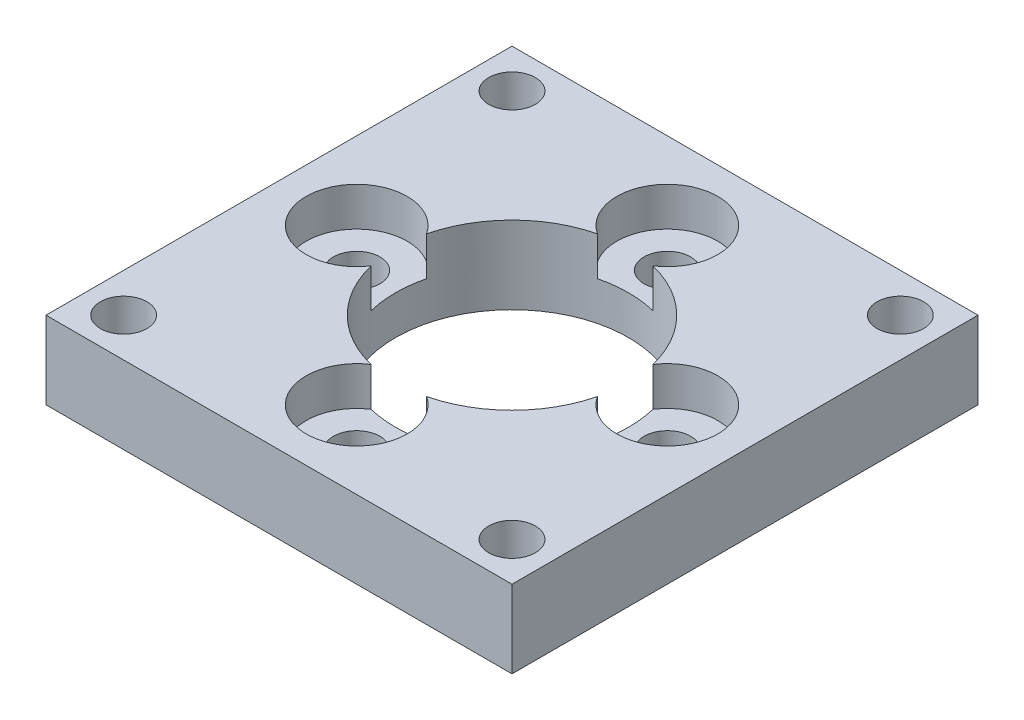
ISO-10303-21;
HEADER;
FILE_DESCRIPTION(('STEP AP214'),'2;1');
FILE_NAME('part.step','',(''),(''),'','','');
FILE_SCHEMA(('AUTOMOTIVE_DESIGN { 1 0 10303 214 1 1 1 1 }'));
ENDSEC;
DATA;
#1=APPLICATION_CONTEXT('core data for automotive mechanical design processes');
#2=APPLICATION_PROTOCOL_DEFINITION('international standard','automotive_design',2000,#1);
#3=PRODUCT_CONTEXT('',#1,'mechanical');
#4=PRODUCT('Part','Part','',(#3));
#5=PRODUCT_RELATED_PRODUCT_CATEGORY('part','',(#4));
#6=PRODUCT_DEFINITION_FORMATION('','',#4);
#7=PRODUCT_DEFINITION_CONTEXT('part definition',#1,'design');
#8=PRODUCT_DEFINITION('design','',#6,#7);
#9=PRODUCT_DEFINITION_SHAPE('','',#8);
#10=(LENGTH_UNIT() NAMED_UNIT(*) SI_UNIT(.MILLI.,.METRE.));
#11=(NAMED_UNIT(*) PLANE_ANGLE_UNIT() SI_UNIT($,.RADIAN.));
#12=(NAMED_UNIT(*) SI_UNIT($,.STERADIAN.) SOLID_ANGLE_UNIT());
#13=UNCERTAINTY_MEASURE_WITH_UNIT(LENGTH_MEASURE(1.E-05),#10,'distance_accuracy_value','');
#14=(GEOMETRIC_REPRESENTATION_CONTEXT(3) GLOBAL_UNCERTAINTY_ASSIGNED_CONTEXT((#13)) GLOBAL_UNIT_ASSIGNED_CONTEXT((#10,
#11,#12)) REPRESENTATION_CONTEXT('',''));
#15=CARTESIAN_POINT('',(0.,0.,0.));
#16=DIRECTION('',(0.,0.,1.));
#17=DIRECTION('',(1.,0.,0.));
#18=AXIS2_PLACEMENT_3D('',#15,#16,#17);
#19=CARTESIAN_POINT('',(50.,0.,-30.));
#20=DIRECTION('',(0.,1.,0.));
#21=DIRECTION('',(0.,0.,1.));
#22=AXIS2_PLACEMENT_3D('',#19,#20,#21);
#23=CYLINDRICAL_SURFACE('',#22,3.00000000000002);
#24=CARTESIAN_POINT('',(50.,0.,-30.));
#25=DIRECTION('',(0.,1.,0.));
#26=DIRECTION('',(0.,0.,1.));
#27=AXIS2_PLACEMENT_3D('',#24,#25,#26);
#28=CIRCLE('',#27,3.00000000000002);
#29=CARTESIAN_POINT('',(50.,0.,-27.));
#30=VERTEX_POINT('',#29);
#31=EDGE_CURVE('E163',#30,#30,#28,.T.);
#32=ORIENTED_EDGE('',*,*,#31,.F.);
#33=EDGE_LOOP('',(#32));
#34=FACE_BOUND('',#33,.T.);
#35=CARTESIAN_POINT('',(50.,5.,-30.));
#36=DIRECTION('',(0.,1.,0.));
#37=DIRECTION('',(0.,0.,1.));
#38=AXIS2_PLACEMENT_3D('',#35,#36,#37);
#39=CIRCLE('',#38,3.00000000000002);
#40=CARTESIAN_POINT('',(50.,5.,-27.));
#41=VERTEX_POINT('',#40);
#42=EDGE_CURVE('E210',#41,#41,#39,.F.);
#43=ORIENTED_EDGE('',*,*,#42,.F.);
#44=EDGE_LOOP('',(#43));
#45=FACE_BOUND('',#44,.T.);
#46=ADVANCED_FACE('F37',(#34,#45),#23,.F.);
#47=CARTESIAN_POINT('',(30.,0.,-10.));
#48=DIRECTION('',(0.,1.,0.));
#49=DIRECTION('',(0.,0.,1.));
#50=AXIS2_PLACEMENT_3D('',#47,#48,#49);
#51=CYLINDRICAL_SURFACE('',#50,3.);
#52=CARTESIAN_POINT('',(30.,0.,-10.));
#53=DIRECTION('',(0.,1.,0.));
#54=DIRECTION('',(0.,0.,1.));
#55=AXIS2_PLACEMENT_3D('',#52,#53,#54);
#56=CIRCLE('',#55,3.);
#57=CARTESIAN_POINT('',(30.,0.,-7.00000000000002));
#58=VERTEX_POINT('',#57);
#59=EDGE_CURVE('E238',#58,#58,#56,.T.);
#60=ORIENTED_EDGE('',*,*,#59,.F.);
#61=EDGE_LOOP('',(#60));
#62=FACE_BOUND('',#61,.T.);
#63=CARTESIAN_POINT('',(30.,5.,-10.));
#64=DIRECTION('',(0.,1.,0.));
#65=DIRECTION('',(0.,0.,1.));
#66=AXIS2_PLACEMENT_3D('',#63,#64,#65);
#67=CIRCLE('',#66,3.);
#68=CARTESIAN_POINT('',(30.,5.,-7.00000000000002));
#69=VERTEX_POINT('',#68);
#70=EDGE_CURVE('E206',#69,#69,#67,.F.);
#71=ORIENTED_EDGE('',*,*,#70,.F.);
#72=EDGE_LOOP('',(#71));
#73=FACE_BOUND('',#72,.T.);
#74=ADVANCED_FACE('F250',(#62,#73),#51,.F.);
#75=CARTESIAN_POINT('',(10.,0.,-30.));
#76=DIRECTION('',(0.,1.,0.));
#77=DIRECTION('',(0.,0.,1.));
#78=AXIS2_PLACEMENT_3D('',#75,#76,#77);
#79=CYLINDRICAL_SURFACE('',#78,3.);
#80=CARTESIAN_POINT('',(10.,0.,-30.));
#81=DIRECTION('',(0.,1.,0.));
#82=DIRECTION('',(0.,0.,1.));
#83=AXIS2_PLACEMENT_3D('',#80,#81,#82);
#84=CIRCLE('',#83,3.);
#85=CARTESIAN_POINT('',(10.,0.,-27.));
#86=VERTEX_POINT('',#85);
#87=EDGE_CURVE('E236',#86,#86,#84,.T.);
#88=ORIENTED_EDGE('',*,*,#87,.F.);
#89=EDGE_LOOP('',(#88));
#90=FACE_BOUND('',#89,.T.);
#91=CARTESIAN_POINT('',(10.,5.,-30.));
#92=DIRECTION('',(0.,1.,0.));
#93=DIRECTION('',(0.,0.,1.));
#94=AXIS2_PLACEMENT_3D('',#91,#92,#93);
#95=CIRCLE('',#94,3.);
#96=CARTESIAN_POINT('',(10.,5.,-27.));
#97=VERTEX_POINT('',#96);
#98=EDGE_CURVE('E202',#97,#97,#95,.F.);
#99=ORIENTED_EDGE('',*,*,#98,.F.);
#100=EDGE_LOOP('',(#99));
#101=FACE_BOUND('',#100,.T.);
#102=ADVANCED_FACE('F282',(#90,#101),#79,.F.);
#103=CARTESIAN_POINT('',(30.,0.,-50.));
#104=DIRECTION('',(0.,1.,0.));
#105=DIRECTION('',(0.,0.,1.));
#106=AXIS2_PLACEMENT_3D('',#103,#104,#105);
#107=CYLINDRICAL_SURFACE('',#106,3.);
#108=CARTESIAN_POINT('',(30.,0.,-50.));
#109=DIRECTION('',(0.,1.,0.));
#110=DIRECTION('',(0.,0.,1.));
#111=AXIS2_PLACEMENT_3D('',#108,#109,#110);
#112=CIRCLE('',#111,3.);
#113=CARTESIAN_POINT('',(30.,0.,-47.));
#114=VERTEX_POINT('',#113);
#115=EDGE_CURVE('E168',#114,#114,#112,.T.);
#116=ORIENTED_EDGE('',*,*,#115,.F.);
#117=EDGE_LOOP('',(#116));
#118=FACE_BOUND('',#117,.T.);
#119=CARTESIAN_POINT('',(30.,5.,-50.));
#120=DIRECTION('',(0.,1.,0.));
#121=DIRECTION('',(0.,0.,1.));
#122=AXIS2_PLACEMENT_3D('',#119,#120,#121);
#123=CIRCLE('',#122,3.);
#124=CARTESIAN_POINT('',(30.,5.,-47.));
#125=VERTEX_POINT('',#124);
#126=EDGE_CURVE('E198',#125,#125,#123,.F.);
#127=ORIENTED_EDGE('',*,*,#126,.F.);
#128=EDGE_LOOP('',(#127));
#129=FACE_BOUND('',#128,.T.);
#130=ADVANCED_FACE('F279',(#118,#129),#107,.F.);
#131=CARTESIAN_POINT('',(0.,10.,0.));
#132=DIRECTION('',(0.,-1.,0.));
#133=DIRECTION('',(0.,0.,-1.));
#134=AXIS2_PLACEMENT_3D('',#131,#132,#133);
#135=PLANE('',#134);
#136=CARTESIAN_POINT('',(4.99999999999999,10.,-55.));
#137=DIRECTION('',(0.,-1.,0.));
#138=DIRECTION('',(0.,0.,-1.));
#139=AXIS2_PLACEMENT_3D('',#136,#137,#138);
#140=CIRCLE('',#139,3.);
#141=CARTESIAN_POINT('',(4.99999999999999,10.,-58.));
#142=VERTEX_POINT('',#141);
#143=EDGE_CURVE('E464',#142,#142,#140,.T.);
#144=ORIENTED_EDGE('',*,*,#143,.T.);
#145=EDGE_LOOP('',(#144));
#146=FACE_BOUND('',#145,.T.);
#147=CARTESIAN_POINT('',(55.,10.,-55.));
#148=DIRECTION('',(0.,-1.,0.));
#149=DIRECTION('',(0.,0.,-1.));
#150=AXIS2_PLACEMENT_3D('',#147,#148,#149);
#151=CIRCLE('',#150,3.00000000000001);
#152=CARTESIAN_POINT('',(55.,10.,-58.));
#153=VERTEX_POINT('',#152);
#154=EDGE_CURVE('E468',#153,#153,#151,.T.);
#155=ORIENTED_EDGE('',*,*,#154,.T.);
#156=EDGE_LOOP('',(#155));
#157=FACE_BOUND('',#156,.T.);
#158=CARTESIAN_POINT('',(55.,10.,-5.));
#159=DIRECTION('',(0.,-1.,0.));
#160=DIRECTION('',(0.,0.,-1.));
#161=AXIS2_PLACEMENT_3D('',#158,#159,#160);
#162=CIRCLE('',#161,3.00000000000001);
#163=CARTESIAN_POINT('',(55.,10.,-8.00000000000001));
#164=VERTEX_POINT('',#163);
#165=EDGE_CURVE('E505',#164,#164,#162,.T.);
#166=ORIENTED_EDGE('',*,*,#165,.T.);
#167=EDGE_LOOP('',(#166));
#168=FACE_BOUND('',#167,.T.);
#169=CARTESIAN_POINT('',(4.99999999999999,10.,-5.));
#170=DIRECTION('',(0.,-1.,0.));
#171=DIRECTION('',(0.,0.,-1.));
#172=AXIS2_PLACEMENT_3D('',#169,#170,#171);
#173=CIRCLE('',#172,3.);
#174=CARTESIAN_POINT('',(4.99999999999999,10.,-8.));
#175=VERTEX_POINT('',#174);
#176=EDGE_CURVE('E476',#175,#175,#173,.T.);
#177=ORIENTED_EDGE('',*,*,#176,.T.);
#178=EDGE_LOOP('',(#177));
#179=FACE_BOUND('',#178,.T.);
#180=DIRECTION('',(0.,0.,1.));
#181=VECTOR('',#180,1.);
#182=CARTESIAN_POINT('',(0.,10.,0.));
#183=LINE('',#182,#181);
#184=CARTESIAN_POINT('',(0.,10.,-60.));
#185=VERTEX_POINT('',#184);
#186=CARTESIAN_POINT('',(0.,10.,0.));
#187=VERTEX_POINT('',#186);
#188=EDGE_CURVE('E169',#185,#187,#183,.T.);
#189=ORIENTED_EDGE('',*,*,#188,.T.);
#190=DIRECTION('',(1.,0.,0.));
#191=VECTOR('',#190,1.);
#192=CARTESIAN_POINT('',(0.,10.,0.));
#193=LINE('',#192,#191);
#194=CARTESIAN_POINT('',(60.,10.,0.));
#195=VERTEX_POINT('',#194);
#196=EDGE_CURVE('E172',#187,#195,#193,.T.);
#197=ORIENTED_EDGE('',*,*,#196,.T.);
#198=DIRECTION('',(0.,0.,-1.));
#199=VECTOR('',#198,1.);
#200=CARTESIAN_POINT('',(60.,10.,0.));
#201=LINE('',#200,#199);
#202=CARTESIAN_POINT('',(60.,10.,-60.));
#203=VERTEX_POINT('',#202);
#204=EDGE_CURVE('E175',#195,#203,#201,.T.);
#205=ORIENTED_EDGE('',*,*,#204,.T.);
#206=DIRECTION('',(-1.,0.,0.));
#207=VECTOR('',#206,1.);
#208=CARTESIAN_POINT('',(0.,10.,-60.));
#209=LINE('',#208,#207);
#210=EDGE_CURVE('E177',#203,#185,#209,.T.);
#211=ORIENTED_EDGE('',*,*,#210,.T.);
#212=EDGE_LOOP('',(#189,#197,#205,#211));
#213=FACE_BOUND('',#212,.T.);
#214=CARTESIAN_POINT('',(30.,10.,-30.));
#215=DIRECTION('',(0.,1.,0.));
#216=DIRECTION('',(0.,0.,1.));
#217=AXIS2_PLACEMENT_3D('',#214,#215,#216);
#218=CIRCLE('',#217,15.);
#219=CARTESIAN_POINT('',(15.43125,10.,-26.4290724681814));
#220=VERTEX_POINT('',#219);
#221=CARTESIAN_POINT('',(26.4290724681814,10.,-15.43125));
#222=VERTEX_POINT('',#221);
#223=EDGE_CURVE('E160',#220,#222,#218,.T.);
#224=ORIENTED_EDGE('',*,*,#223,.F.);
#225=CARTESIAN_POINT('',(9.99999999999998,10.,-30.));
#226=DIRECTION('',(0.,1.,0.));
#227=DIRECTION('',(0.,0.,1.));
#228=AXIS2_PLACEMENT_3D('',#225,#226,#227);
#229=CIRCLE('',#228,6.5);
#230=CARTESIAN_POINT('',(15.43125,10.,-33.5709275318186));
#231=VERTEX_POINT('',#230);
#232=EDGE_CURVE('E225',#231,#220,#229,.T.);
#233=ORIENTED_EDGE('',*,*,#232,.F.);
#234=CARTESIAN_POINT('',(26.4290724681814,10.,-44.56875));
#235=VERTEX_POINT('',#234);
#236=EDGE_CURVE('E147',#235,#231,#218,.T.);
#237=ORIENTED_EDGE('',*,*,#236,.F.);
#238=CARTESIAN_POINT('',(30.,10.,-50.));
#239=DIRECTION('',(0.,1.,0.));
#240=DIRECTION('',(0.,0.,1.));
#241=AXIS2_PLACEMENT_3D('',#238,#239,#240);
#242=CIRCLE('',#241,6.5);
#243=CARTESIAN_POINT('',(33.5709275318186,10.,-44.56875));
#244=VERTEX_POINT('',#243);
#245=EDGE_CURVE('E129',#244,#235,#242,.T.);
#246=ORIENTED_EDGE('',*,*,#245,.F.);
#247=CARTESIAN_POINT('',(44.56875,10.,-33.5709275318186));
#248=VERTEX_POINT('',#247);
#249=EDGE_CURVE('E144',#248,#244,#218,.T.);
#250=ORIENTED_EDGE('',*,*,#249,.F.);
#251=CARTESIAN_POINT('',(50.,10.,-30.));
#252=DIRECTION('',(0.,1.,0.));
#253=DIRECTION('',(0.,0.,1.));
#254=AXIS2_PLACEMENT_3D('',#251,#252,#253);
#255=CIRCLE('',#254,6.49999999999999);
#256=CARTESIAN_POINT('',(44.56875,10.,-26.4290724681814));
#257=VERTEX_POINT('',#256);
#258=EDGE_CURVE('E488',#257,#248,#255,.T.);
#259=ORIENTED_EDGE('',*,*,#258,.F.);
#260=CARTESIAN_POINT('',(33.5709275318185,10.,-15.43125));
#261=VERTEX_POINT('',#260);
#262=EDGE_CURVE('E156',#261,#257,#218,.T.);
#263=ORIENTED_EDGE('',*,*,#262,.F.);
#264=CARTESIAN_POINT('',(30.,10.,-9.99999999999998));
#265=DIRECTION('',(0.,1.,0.));
#266=DIRECTION('',(0.,0.,1.));
#267=AXIS2_PLACEMENT_3D('',#264,#265,#266);
#268=CIRCLE('',#267,6.50000000000001);
#269=EDGE_CURVE('E485',#222,#261,#268,.T.);
#270=ORIENTED_EDGE('',*,*,#269,.F.);
#271=EDGE_LOOP('',(#224,#233,#237,#246,#250,#259,#263,#270));
#272=FACE_BOUND('',#271,.T.);
#273=ADVANCED_FACE('F142',(#146,#157,#168,#179,#213,#272),#135,.F.);
#274=CARTESIAN_POINT('',(0.,0.,0.));
#275=DIRECTION('',(0.,-1.,0.));
#276=DIRECTION('',(0.,0.,-1.));
#277=AXIS2_PLACEMENT_3D('',#274,#275,#276);
#278=PLANE('',#277);
#279=CARTESIAN_POINT('',(4.99999999999999,0.,-55.));
#280=DIRECTION('',(0.,-1.,0.));
#281=DIRECTION('',(0.,0.,-1.));
#282=AXIS2_PLACEMENT_3D('',#279,#280,#281);
#283=CIRCLE('',#282,3.);
#284=CARTESIAN_POINT('',(4.99999999999999,0.,-58.));
#285=VERTEX_POINT('',#284);
#286=EDGE_CURVE('E467',#285,#285,#283,.T.);
#287=ORIENTED_EDGE('',*,*,#286,.F.);
#288=EDGE_LOOP('',(#287));
#289=FACE_BOUND('',#288,.T.);
#290=CARTESIAN_POINT('',(55.,0.,-55.));
#291=DIRECTION('',(0.,-1.,0.));
#292=DIRECTION('',(0.,0.,-1.));
#293=AXIS2_PLACEMENT_3D('',#290,#291,#292);
#294=CIRCLE('',#293,3.00000000000001);
#295=CARTESIAN_POINT('',(55.,0.,-58.));
#296=VERTEX_POINT('',#295);
#297=EDGE_CURVE('E471',#296,#296,#294,.T.);
#298=ORIENTED_EDGE('',*,*,#297,.F.);
#299=EDGE_LOOP('',(#298));
#300=FACE_BOUND('',#299,.T.);
#301=CARTESIAN_POINT('',(55.,0.,-5.));
#302=DIRECTION('',(0.,-1.,0.));
#303=DIRECTION('',(0.,0.,-1.));
#304=AXIS2_PLACEMENT_3D('',#301,#302,#303);
#305=CIRCLE('',#304,3.00000000000001);
#306=CARTESIAN_POINT('',(55.,0.,-8.00000000000001));
#307=VERTEX_POINT('',#306);
#308=EDGE_CURVE('E482',#307,#307,#305,.T.);
#309=ORIENTED_EDGE('',*,*,#308,.F.);
#310=EDGE_LOOP('',(#309));
#311=FACE_BOUND('',#310,.T.);
#312=CARTESIAN_POINT('',(4.99999999999999,0.,-5.));
#313=DIRECTION('',(0.,-1.,0.));
#314=DIRECTION('',(0.,0.,-1.));
#315=AXIS2_PLACEMENT_3D('',#312,#313,#314);
#316=CIRCLE('',#315,3.);
#317=CARTESIAN_POINT('',(4.99999999999999,0.,-8.));
#318=VERTEX_POINT('',#317);
#319=EDGE_CURVE('E479',#318,#318,#316,.T.);
#320=ORIENTED_EDGE('',*,*,#319,.F.);
#321=EDGE_LOOP('',(#320));
#322=FACE_BOUND('',#321,.T.);
#323=ORIENTED_EDGE('',*,*,#115,.T.);
#324=EDGE_LOOP('',(#323));
#325=FACE_BOUND('',#324,.T.);
#326=ORIENTED_EDGE('',*,*,#87,.T.);
#327=EDGE_LOOP('',(#326));
#328=FACE_BOUND('',#327,.T.);
#329=ORIENTED_EDGE('',*,*,#59,.T.);
#330=EDGE_LOOP('',(#329));
#331=FACE_BOUND('',#330,.T.);
#332=ORIENTED_EDGE('',*,*,#31,.T.);
#333=EDGE_LOOP('',(#332));
#334=FACE_BOUND('',#333,.T.);
#335=DIRECTION('',(0.,0.,1.));
#336=VECTOR('',#335,1.);
#337=CARTESIAN_POINT('',(0.,0.,0.));
#338=LINE('',#337,#336);
#339=CARTESIAN_POINT('',(0.,0.,-60.));
#340=VERTEX_POINT('',#339);
#341=CARTESIAN_POINT('',(0.,0.,0.));
#342=VERTEX_POINT('',#341);
#343=EDGE_CURVE('E159',#340,#342,#338,.T.);
#344=ORIENTED_EDGE('',*,*,#343,.F.);
#345=DIRECTION('',(-1.,0.,0.));
#346=VECTOR('',#345,1.);
#347=CARTESIAN_POINT('',(0.,0.,-60.));
#348=LINE('',#347,#346);
#349=CARTESIAN_POINT('',(60.,0.,-60.));
#350=VERTEX_POINT('',#349);
#351=EDGE_CURVE('E173',#350,#340,#348,.T.);
#352=ORIENTED_EDGE('',*,*,#351,.F.);
#353=DIRECTION('',(0.,0.,-1.));
#354=VECTOR('',#353,1.);
#355=CARTESIAN_POINT('',(60.,0.,0.));
#356=LINE('',#355,#354);
#357=CARTESIAN_POINT('',(60.,0.,0.));
#358=VERTEX_POINT('',#357);
#359=EDGE_CURVE('E184',#358,#350,#356,.T.);
#360=ORIENTED_EDGE('',*,*,#359,.F.);
#361=DIRECTION('',(1.,0.,0.));
#362=VECTOR('',#361,1.);
#363=CARTESIAN_POINT('',(0.,0.,0.));
#364=LINE('',#363,#362);
#365=EDGE_CURVE('E182',#342,#358,#364,.T.);
#366=ORIENTED_EDGE('',*,*,#365,.F.);
#367=EDGE_LOOP('',(#344,#352,#360,#366));
#368=FACE_BOUND('',#367,.T.);
#369=CARTESIAN_POINT('',(30.,0.,-30.));
#370=DIRECTION('',(0.,1.,0.));
#371=DIRECTION('',(0.,0.,1.));
#372=AXIS2_PLACEMENT_3D('',#369,#370,#371);
#373=CIRCLE('',#372,15.);
#374=CARTESIAN_POINT('',(30.,0.,-15.));
#375=VERTEX_POINT('',#374);
#376=EDGE_CURVE('E165',#375,#375,#373,.T.);
#377=ORIENTED_EDGE('',*,*,#376,.T.);
#378=EDGE_LOOP('',(#377));
#379=FACE_BOUND('',#378,.T.);
#380=ADVANCED_FACE('F245',(#289,#300,#311,#322,#325,#328,#331,#334,#368,#379),#278,.T.);
#381=CARTESIAN_POINT('',(0.,10.,0.));
#382=DIRECTION('',(1.,0.,0.));
#383=DIRECTION('',(0.,0.,-1.));
#384=AXIS2_PLACEMENT_3D('',#381,#382,#383);
#385=PLANE('',#384);
#386=ORIENTED_EDGE('',*,*,#343,.T.);
#387=DIRECTION('',(0.,-1.,0.));
#388=VECTOR('',#387,1.);
#389=CARTESIAN_POINT('',(0.,10.,0.));
#390=LINE('',#389,#388);
#391=EDGE_CURVE('E195',#187,#342,#390,.T.);
#392=ORIENTED_EDGE('',*,*,#391,.F.);
#393=ORIENTED_EDGE('',*,*,#188,.F.);
#394=DIRECTION('',(0.,-1.,0.));
#395=VECTOR('',#394,1.);
#396=CARTESIAN_POINT('',(0.,10.,-60.));
#397=LINE('',#396,#395);
#398=EDGE_CURVE('E179',#185,#340,#397,.T.);
#399=ORIENTED_EDGE('',*,*,#398,.T.);
#400=EDGE_LOOP('',(#386,#392,#393,#399));
#401=FACE_BOUND('',#400,.T.);
#402=ADVANCED_FACE('F39',(#401),#385,.F.);
#403=CARTESIAN_POINT('',(0.,10.,0.));
#404=DIRECTION('',(0.,0.,-1.));
#405=DIRECTION('',(-1.,0.,0.));
#406=AXIS2_PLACEMENT_3D('',#403,#404,#405);
#407=PLANE('',#406);
#408=ORIENTED_EDGE('',*,*,#365,.T.);
#409=DIRECTION('',(0.,-1.,0.));
#410=VECTOR('',#409,1.);
#411=CARTESIAN_POINT('',(60.,10.,0.));
#412=LINE('',#411,#410);
#413=EDGE_CURVE('E192',#195,#358,#412,.T.);
#414=ORIENTED_EDGE('',*,*,#413,.F.);
#415=ORIENTED_EDGE('',*,*,#196,.F.);
#416=ORIENTED_EDGE('',*,*,#391,.T.);
#417=EDGE_LOOP('',(#408,#414,#415,#416));
#418=FACE_BOUND('',#417,.T.);
#419=ADVANCED_FACE('F304',(#418),#407,.F.);
#420=CARTESIAN_POINT('',(60.,10.,0.));
#421=DIRECTION('',(-1.,0.,0.));
#422=DIRECTION('',(0.,0.,1.));
#423=AXIS2_PLACEMENT_3D('',#420,#421,#422);
#424=PLANE('',#423);
#425=ORIENTED_EDGE('',*,*,#359,.T.);
#426=DIRECTION('',(0.,-1.,0.));
#427=VECTOR('',#426,1.);
#428=CARTESIAN_POINT('',(60.,10.,-60.));
#429=LINE('',#428,#427);
#430=EDGE_CURVE('E189',#203,#350,#429,.T.);
#431=ORIENTED_EDGE('',*,*,#430,.F.);
#432=ORIENTED_EDGE('',*,*,#204,.F.);
#433=ORIENTED_EDGE('',*,*,#413,.T.);
#434=EDGE_LOOP('',(#425,#431,#432,#433));
#435=FACE_BOUND('',#434,.T.);
#436=ADVANCED_FACE('F301',(#435),#424,.F.);
#437=CARTESIAN_POINT('',(0.,10.,-60.));
#438=DIRECTION('',(0.,0.,1.));
#439=DIRECTION('',(1.,0.,0.));
#440=AXIS2_PLACEMENT_3D('',#437,#438,#439);
#441=PLANE('',#440);
#442=ORIENTED_EDGE('',*,*,#351,.T.);
#443=ORIENTED_EDGE('',*,*,#398,.F.);
#444=ORIENTED_EDGE('',*,*,#210,.F.);
#445=ORIENTED_EDGE('',*,*,#430,.T.);
#446=EDGE_LOOP('',(#442,#443,#444,#445));
#447=FACE_BOUND('',#446,.T.);
#448=ADVANCED_FACE('F292',(#447),#441,.F.);
#449=CARTESIAN_POINT('',(30.,10.,-30.));
#450=DIRECTION('',(0.,-1.,0.));
#451=DIRECTION('',(0.,0.,-1.));
#452=AXIS2_PLACEMENT_3D('',#449,#450,#451);
#453=CYLINDRICAL_SURFACE('',#452,15.);
#454=DIRECTION('',(0.,1.,0.));
#455=VECTOR('',#454,1.);
#456=CARTESIAN_POINT('',(15.43125,7.5,-33.5709275318186));
#457=LINE('',#456,#455);
#458=CARTESIAN_POINT('',(15.43125,5.,-33.5709275318186));
#459=VERTEX_POINT('',#458);
#460=EDGE_CURVE('E11',#459,#231,#457,.T.);
#461=ORIENTED_EDGE('',*,*,#460,.F.);
#462=CARTESIAN_POINT('',(30.,5.,-30.));
#463=DIRECTION('',(0.,1.,0.));
#464=DIRECTION('',(0.,0.,1.));
#465=AXIS2_PLACEMENT_3D('',#462,#463,#464);
#466=CIRCLE('',#465,15.);
#467=CARTESIAN_POINT('',(15.43125,5.,-26.4290724681814));
#468=VERTEX_POINT('',#467);
#469=EDGE_CURVE('E205',#459,#468,#466,.T.);
#470=ORIENTED_EDGE('',*,*,#469,.T.);
#471=DIRECTION('',(0.,1.,0.));
#472=VECTOR('',#471,1.);
#473=CARTESIAN_POINT('',(15.43125,7.5,-26.4290724681814));
#474=LINE('',#473,#472);
#475=EDGE_CURVE('E45',#220,#468,#474,.F.);
#476=ORIENTED_EDGE('',*,*,#475,.F.);
#477=ORIENTED_EDGE('',*,*,#223,.T.);
#478=DIRECTION('',(0.,1.,0.));
#479=VECTOR('',#478,1.);
#480=CARTESIAN_POINT('',(26.4290724681814,7.5,-15.43125));
#481=LINE('',#480,#479);
#482=CARTESIAN_POINT('',(26.4290724681814,5.,-15.43125));
#483=VERTEX_POINT('',#482);
#484=EDGE_CURVE('E220',#483,#222,#481,.T.);
#485=ORIENTED_EDGE('',*,*,#484,.F.);
#486=CARTESIAN_POINT('',(30.,5.,-30.));
#487=DIRECTION('',(0.,1.,0.));
#488=DIRECTION('',(0.,0.,1.));
#489=AXIS2_PLACEMENT_3D('',#486,#487,#488);
#490=CIRCLE('',#489,15.);
#491=CARTESIAN_POINT('',(33.5709275318185,5.,-15.43125));
#492=VERTEX_POINT('',#491);
#493=EDGE_CURVE('E209',#483,#492,#490,.T.);
#494=ORIENTED_EDGE('',*,*,#493,.T.);
#495=DIRECTION('',(0.,1.,0.));
#496=VECTOR('',#495,1.);
#497=CARTESIAN_POINT('',(33.5709275318186,7.5,-15.43125));
#498=LINE('',#497,#496);
#499=EDGE_CURVE('E218',#261,#492,#498,.F.);
#500=ORIENTED_EDGE('',*,*,#499,.F.);
#501=ORIENTED_EDGE('',*,*,#262,.T.);
#502=DIRECTION('',(0.,1.,0.));
#503=VECTOR('',#502,1.);
#504=CARTESIAN_POINT('',(44.56875,7.5,-26.4290724681814));
#505=LINE('',#504,#503);
#506=CARTESIAN_POINT('',(44.56875,5.,-26.4290724681814));
#507=VERTEX_POINT('',#506);
#508=EDGE_CURVE('E216',#507,#257,#505,.T.);
#509=ORIENTED_EDGE('',*,*,#508,.F.);
#510=CARTESIAN_POINT('',(30.,5.,-30.));
#511=DIRECTION('',(0.,1.,0.));
#512=DIRECTION('',(0.,0.,1.));
#513=AXIS2_PLACEMENT_3D('',#510,#511,#512);
#514=CIRCLE('',#513,15.);
#515=CARTESIAN_POINT('',(44.56875,5.,-33.5709275318186));
#516=VERTEX_POINT('',#515);
#517=EDGE_CURVE('E213',#507,#516,#514,.T.);
#518=ORIENTED_EDGE('',*,*,#517,.T.);
#519=DIRECTION('',(0.,1.,0.));
#520=VECTOR('',#519,1.);
#521=CARTESIAN_POINT('',(44.56875,7.5,-33.5709275318186));
#522=LINE('',#521,#520);
#523=EDGE_CURVE('E135',#248,#516,#522,.F.);
#524=ORIENTED_EDGE('',*,*,#523,.F.);
#525=ORIENTED_EDGE('',*,*,#249,.T.);
#526=DIRECTION('',(0.,1.,0.));
#527=VECTOR('',#526,1.);
#528=CARTESIAN_POINT('',(33.5709275318186,7.5,-44.56875));
#529=LINE('',#528,#527);
#530=CARTESIAN_POINT('',(33.5709275318186,5.,-44.56875));
#531=VERTEX_POINT('',#530);
#532=EDGE_CURVE('E125',#531,#244,#529,.T.);
#533=ORIENTED_EDGE('',*,*,#532,.F.);
#534=CARTESIAN_POINT('',(30.,5.,-30.));
#535=DIRECTION('',(0.,1.,0.));
#536=DIRECTION('',(0.,0.,1.));
#537=AXIS2_PLACEMENT_3D('',#534,#535,#536);
#538=CIRCLE('',#537,15.);
#539=CARTESIAN_POINT('',(26.4290724681814,5.,-44.56875));
#540=VERTEX_POINT('',#539);
#541=EDGE_CURVE('E201',#531,#540,#538,.T.);
#542=ORIENTED_EDGE('',*,*,#541,.T.);
#543=DIRECTION('',(0.,1.,0.));
#544=VECTOR('',#543,1.);
#545=CARTESIAN_POINT('',(26.4290724681814,7.5,-44.56875));
#546=LINE('',#545,#544);
#547=EDGE_CURVE('E136',#235,#540,#546,.F.);
#548=ORIENTED_EDGE('',*,*,#547,.F.);
#549=ORIENTED_EDGE('',*,*,#236,.T.);
#550=EDGE_LOOP('',(#461,#470,#476,#477,#485,#494,#500,#501,#509,#518,#524,#525,#533,#542,#548,#549));
#551=FACE_BOUND('',#550,.T.);
#552=ORIENTED_EDGE('',*,*,#376,.F.);
#553=EDGE_LOOP('',(#552));
#554=FACE_BOUND('',#553,.T.);
#555=ADVANCED_FACE('F152',(#551,#554),#453,.F.);
#556=CARTESIAN_POINT('',(30.,5.,-50.));
#557=DIRECTION('',(0.,1.,0.));
#558=DIRECTION('',(0.,0.,1.));
#559=AXIS2_PLACEMENT_3D('',#556,#557,#558);
#560=PLANE('',#559);
#561=CARTESIAN_POINT('',(30.,5.,-50.));
#562=DIRECTION('',(0.,1.,0.));
#563=DIRECTION('',(0.,0.,1.));
#564=AXIS2_PLACEMENT_3D('',#561,#562,#563);
#565=CIRCLE('',#564,6.5);
#566=EDGE_CURVE('E131',#531,#540,#565,.T.);
#567=ORIENTED_EDGE('',*,*,#566,.T.);
#568=ORIENTED_EDGE('',*,*,#541,.F.);
#569=EDGE_LOOP('',(#567,#568));
#570=FACE_BOUND('',#569,.T.);
#571=ORIENTED_EDGE('',*,*,#126,.T.);
#572=EDGE_LOOP('',(#571));
#573=FACE_BOUND('',#572,.T.);
#574=ADVANCED_FACE('F275',(#570,#573),#560,.T.);
#575=CARTESIAN_POINT('',(30.,5.,-50.));
#576=DIRECTION('',(0.,1.,0.));
#577=DIRECTION('',(0.,0.,1.));
#578=AXIS2_PLACEMENT_3D('',#575,#576,#577);
#579=CYLINDRICAL_SURFACE('',#578,6.5);
#580=ORIENTED_EDGE('',*,*,#532,.T.);
#581=ORIENTED_EDGE('',*,*,#245,.T.);
#582=ORIENTED_EDGE('',*,*,#547,.T.);
#583=ORIENTED_EDGE('',*,*,#566,.F.);
#584=EDGE_LOOP('',(#580,#581,#582,#583));
#585=FACE_BOUND('',#584,.T.);
#586=ADVANCED_FACE('F127',(#585),#579,.F.);
#587=CARTESIAN_POINT('',(9.99999999999998,5.,-30.));
#588=DIRECTION('',(0.,1.,0.));
#589=DIRECTION('',(0.,0.,1.));
#590=AXIS2_PLACEMENT_3D('',#587,#588,#589);
#591=PLANE('',#590);
#592=CARTESIAN_POINT('',(9.99999999999998,5.,-30.));
#593=DIRECTION('',(0.,1.,0.));
#594=DIRECTION('',(0.,0.,1.));
#595=AXIS2_PLACEMENT_3D('',#592,#593,#594);
#596=CIRCLE('',#595,6.5);
#597=EDGE_CURVE('E51',#459,#468,#596,.T.);
#598=ORIENTED_EDGE('',*,*,#597,.T.);
#599=ORIENTED_EDGE('',*,*,#469,.F.);
#600=EDGE_LOOP('',(#598,#599));
#601=FACE_BOUND('',#600,.T.);
#602=ORIENTED_EDGE('',*,*,#98,.T.);
#603=EDGE_LOOP('',(#602));
#604=FACE_BOUND('',#603,.T.);
#605=ADVANCED_FACE('F274',(#601,#604),#591,.T.);
#606=CARTESIAN_POINT('',(9.99999999999998,5.,-30.));
#607=DIRECTION('',(0.,1.,0.));
#608=DIRECTION('',(0.,0.,1.));
#609=AXIS2_PLACEMENT_3D('',#606,#607,#608);
#610=CYLINDRICAL_SURFACE('',#609,6.5);
#611=ORIENTED_EDGE('',*,*,#460,.T.);
#612=ORIENTED_EDGE('',*,*,#232,.T.);
#613=ORIENTED_EDGE('',*,*,#475,.T.);
#614=ORIENTED_EDGE('',*,*,#597,.F.);
#615=EDGE_LOOP('',(#611,#612,#613,#614));
#616=FACE_BOUND('',#615,.T.);
#617=ADVANCED_FACE('F224',(#616),#610,.F.);
#618=CARTESIAN_POINT('',(30.,5.,-9.99999999999998));
#619=DIRECTION('',(0.,1.,0.));
#620=DIRECTION('',(0.,0.,1.));
#621=AXIS2_PLACEMENT_3D('',#618,#619,#620);
#622=PLANE('',#621);
#623=CARTESIAN_POINT('',(30.,5.,-9.99999999999998));
#624=DIRECTION('',(0.,1.,0.));
#625=DIRECTION('',(0.,0.,1.));
#626=AXIS2_PLACEMENT_3D('',#623,#624,#625);
#627=CIRCLE('',#626,6.50000000000001);
#628=EDGE_CURVE('E58',#483,#492,#627,.T.);
#629=ORIENTED_EDGE('',*,*,#628,.T.);
#630=ORIENTED_EDGE('',*,*,#493,.F.);
#631=EDGE_LOOP('',(#629,#630));
#632=FACE_BOUND('',#631,.T.);
#633=ORIENTED_EDGE('',*,*,#70,.T.);
#634=EDGE_LOOP('',(#633));
#635=FACE_BOUND('',#634,.T.);
#636=ADVANCED_FACE('F267',(#632,#635),#622,.T.);
#637=CARTESIAN_POINT('',(30.,5.,-9.99999999999998));
#638=DIRECTION('',(0.,1.,0.));
#639=DIRECTION('',(0.,0.,1.));
#640=AXIS2_PLACEMENT_3D('',#637,#638,#639);
#641=CYLINDRICAL_SURFACE('',#640,6.50000000000001);
#642=ORIENTED_EDGE('',*,*,#484,.T.);
#643=ORIENTED_EDGE('',*,*,#269,.T.);
#644=ORIENTED_EDGE('',*,*,#499,.T.);
#645=ORIENTED_EDGE('',*,*,#628,.F.);
#646=EDGE_LOOP('',(#642,#643,#644,#645));
#647=FACE_BOUND('',#646,.T.);
#648=ADVANCED_FACE('F257',(#647),#641,.F.);
#649=CARTESIAN_POINT('',(50.,5.,-30.));
#650=DIRECTION('',(0.,1.,0.));
#651=DIRECTION('',(0.,0.,1.));
#652=AXIS2_PLACEMENT_3D('',#649,#650,#651);
#653=PLANE('',#652);
#654=CARTESIAN_POINT('',(50.,5.,-30.));
#655=DIRECTION('',(0.,1.,0.));
#656=DIRECTION('',(0.,0.,1.));
#657=AXIS2_PLACEMENT_3D('',#654,#655,#656);
#658=CIRCLE('',#657,6.49999999999999);
#659=EDGE_CURVE('E148',#507,#516,#658,.T.);
#660=ORIENTED_EDGE('',*,*,#659,.T.);
#661=ORIENTED_EDGE('',*,*,#517,.F.);
#662=EDGE_LOOP('',(#660,#661));
#663=FACE_BOUND('',#662,.T.);
#664=ORIENTED_EDGE('',*,*,#42,.T.);
#665=EDGE_LOOP('',(#664));
#666=FACE_BOUND('',#665,.T.);
#667=ADVANCED_FACE('F254',(#663,#666),#653,.T.);
#668=CARTESIAN_POINT('',(50.,5.,-30.));
#669=DIRECTION('',(0.,1.,0.));
#670=DIRECTION('',(0.,0.,1.));
#671=AXIS2_PLACEMENT_3D('',#668,#669,#670);
#672=CYLINDRICAL_SURFACE('',#671,6.49999999999999);
#673=ORIENTED_EDGE('',*,*,#508,.T.);
#674=ORIENTED_EDGE('',*,*,#258,.T.);
#675=ORIENTED_EDGE('',*,*,#523,.T.);
#676=ORIENTED_EDGE('',*,*,#659,.F.);
#677=EDGE_LOOP('',(#673,#674,#675,#676));
#678=FACE_BOUND('',#677,.T.);
#679=ADVANCED_FACE('F256',(#678),#672,.F.);
#680=CARTESIAN_POINT('',(4.99999999999999,10.,-5.));
#681=DIRECTION('',(0.,-1.,0.));
#682=DIRECTION('',(0.,0.,-1.));
#683=AXIS2_PLACEMENT_3D('',#680,#681,#682);
#684=CYLINDRICAL_SURFACE('',#683,3.);
#685=ORIENTED_EDGE('',*,*,#176,.F.);
#686=EDGE_LOOP('',(#685));
#687=FACE_BOUND('',#686,.T.);
#688=ORIENTED_EDGE('',*,*,#319,.T.);
#689=EDGE_LOOP('',(#688));
#690=FACE_BOUND('',#689,.T.);
#691=ADVANCED_FACE('F264',(#687,#690),#684,.F.);
#692=CARTESIAN_POINT('',(55.,10.,-5.));
#693=DIRECTION('',(0.,-1.,0.));
#694=DIRECTION('',(0.,0.,-1.));
#695=AXIS2_PLACEMENT_3D('',#692,#693,#694);
#696=CYLINDRICAL_SURFACE('',#695,3.00000000000001);
#697=ORIENTED_EDGE('',*,*,#165,.F.);
#698=EDGE_LOOP('',(#697));
#699=FACE_BOUND('',#698,.T.);
#700=ORIENTED_EDGE('',*,*,#308,.T.);
#701=EDGE_LOOP('',(#700));
#702=FACE_BOUND('',#701,.T.);
#703=ADVANCED_FACE('F427',(#699,#702),#696,.F.);
#704=CARTESIAN_POINT('',(55.,10.,-55.));
#705=DIRECTION('',(0.,-1.,0.));
#706=DIRECTION('',(0.,0.,-1.));
#707=AXIS2_PLACEMENT_3D('',#704,#705,#706);
#708=CYLINDRICAL_SURFACE('',#707,3.00000000000001);
#709=ORIENTED_EDGE('',*,*,#154,.F.);
#710=EDGE_LOOP('',(#709));
#711=FACE_BOUND('',#710,.T.);
#712=ORIENTED_EDGE('',*,*,#297,.T.);
#713=EDGE_LOOP('',(#712));
#714=FACE_BOUND('',#713,.T.);
#715=ADVANCED_FACE('F434',(#711,#714),#708,.F.);
#716=CARTESIAN_POINT('',(4.99999999999999,10.,-55.));
#717=DIRECTION('',(0.,-1.,0.));
#718=DIRECTION('',(0.,0.,-1.));
#719=AXIS2_PLACEMENT_3D('',#716,#717,#718);
#720=CYLINDRICAL_SURFACE('',#719,3.);
#721=ORIENTED_EDGE('',*,*,#143,.F.);
#722=EDGE_LOOP('',(#721));
#723=FACE_BOUND('',#722,.T.);
#724=ORIENTED_EDGE('',*,*,#286,.T.);
#725=EDGE_LOOP('',(#724));
#726=FACE_BOUND('',#725,.T.);
#727=ADVANCED_FACE('F442',(#723,#726),#720,.F.);
#728=CLOSED_SHELL('',(#46,#74,#102,#130,#273,#380,#402,#419,#436,#448,#555,#574,#586,#605,#617,
#636,#648,#667,#679,#691,#703,#715,#727));
#729=MANIFOLD_SOLID_BREP('B2',#728);
#730=ADVANCED_BREP_SHAPE_REPRESENTATION('',(#18,#729),#14);
#731=SHAPE_DEFINITION_REPRESENTATION(#9,#730);
ENDSEC;
END-ISO-10303-21;
